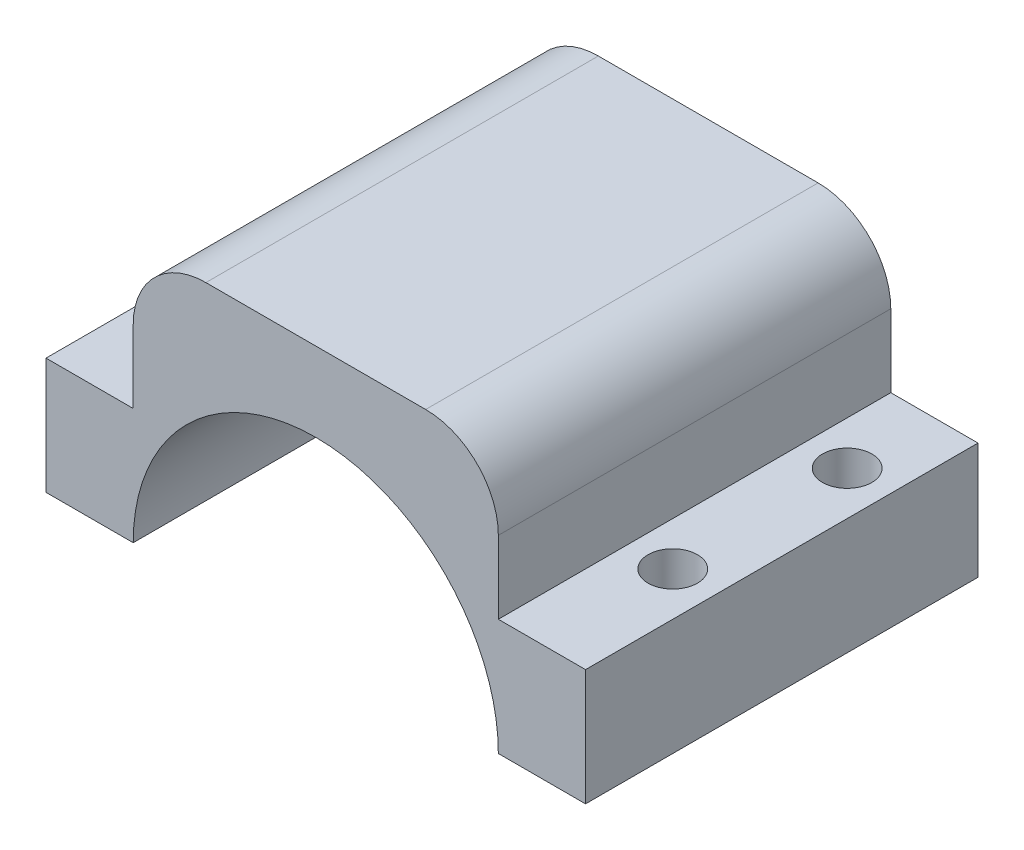
ISO-10303-21;
HEADER;
FILE_DESCRIPTION(('STEP AP214'),'2;1');
FILE_NAME('part.step','',(''),(''),'','','');
FILE_SCHEMA(('AUTOMOTIVE_DESIGN { 1 0 10303 214 1 1 1 1 }'));
ENDSEC;
DATA;
#1=APPLICATION_CONTEXT('core data for automotive mechanical design processes');
#2=APPLICATION_PROTOCOL_DEFINITION('international standard','automotive_design',2000,#1);
#3=PRODUCT_CONTEXT('',#1,'mechanical');
#4=PRODUCT('Part','Part','',(#3));
#5=PRODUCT_RELATED_PRODUCT_CATEGORY('part','',(#4));
#6=PRODUCT_DEFINITION_FORMATION('','',#4);
#7=PRODUCT_DEFINITION_CONTEXT('part definition',#1,'design');
#8=PRODUCT_DEFINITION('design','',#6,#7);
#9=PRODUCT_DEFINITION_SHAPE('','',#8);
#10=(LENGTH_UNIT() NAMED_UNIT(*) SI_UNIT(.MILLI.,.METRE.));
#11=(NAMED_UNIT(*) PLANE_ANGLE_UNIT() SI_UNIT($,.RADIAN.));
#12=(NAMED_UNIT(*) SI_UNIT($,.STERADIAN.) SOLID_ANGLE_UNIT());
#13=UNCERTAINTY_MEASURE_WITH_UNIT(LENGTH_MEASURE(1.E-05),#10,'distance_accuracy_value','');
#14=(GEOMETRIC_REPRESENTATION_CONTEXT(3) GLOBAL_UNCERTAINTY_ASSIGNED_CONTEXT((#13)) GLOBAL_UNIT_ASSIGNED_CONTEXT((#10,
#11,#12)) REPRESENTATION_CONTEXT('',''));
#15=CARTESIAN_POINT('',(0.,0.,0.));
#16=DIRECTION('',(0.,0.,1.));
#17=DIRECTION('',(1.,0.,0.));
#18=AXIS2_PLACEMENT_3D('',#15,#16,#17);
#19=CARTESIAN_POINT('',(0.,0.,27.));
#20=DIRECTION('',(0.,0.,-1.));
#21=DIRECTION('',(-1.,0.,0.));
#22=AXIS2_PLACEMENT_3D('',#19,#20,#21);
#23=CYLINDRICAL_SURFACE('',#22,12.5600623846513);
#24=CARTESIAN_POINT('',(0.,0.,0.));
#25=DIRECTION('',(0.,0.,-1.));
#26=DIRECTION('',(-1.,0.,0.));
#27=AXIS2_PLACEMENT_3D('',#24,#25,#26);
#28=CIRCLE('',#27,12.5600623846513);
#29=CARTESIAN_POINT('',(-12.5600623846513,0.,0.));
#30=VERTEX_POINT('',#29);
#31=CARTESIAN_POINT('',(12.5600623846513,0.,0.));
#32=VERTEX_POINT('',#31);
#33=EDGE_CURVE('E233',#30,#32,#28,.T.);
#34=ORIENTED_EDGE('',*,*,#33,.T.);
#35=DIRECTION('',(0.,0.,-1.));
#36=VECTOR('',#35,1.);
#37=CARTESIAN_POINT('',(12.5600623846513,0.,27.));
#38=LINE('',#37,#36);
#39=CARTESIAN_POINT('',(12.5600623846513,0.,27.));
#40=VERTEX_POINT('',#39);
#41=EDGE_CURVE('E165',#40,#32,#38,.T.);
#42=ORIENTED_EDGE('',*,*,#41,.F.);
#43=CARTESIAN_POINT('',(0.,0.,27.));
#44=DIRECTION('',(0.,0.,-1.));
#45=DIRECTION('',(-1.,0.,0.));
#46=AXIS2_PLACEMENT_3D('',#43,#44,#45);
#47=CIRCLE('',#46,12.5600623846513);
#48=CARTESIAN_POINT('',(-12.5600623846513,0.,27.));
#49=VERTEX_POINT('',#48);
#50=EDGE_CURVE('E150',#49,#40,#47,.T.);
#51=ORIENTED_EDGE('',*,*,#50,.F.);
#52=DIRECTION('',(0.,0.,-1.));
#53=VECTOR('',#52,1.);
#54=CARTESIAN_POINT('',(-12.5600623846513,0.,27.));
#55=LINE('',#54,#53);
#56=EDGE_CURVE('E156',#49,#30,#55,.T.);
#57=ORIENTED_EDGE('',*,*,#56,.T.);
#58=EDGE_LOOP('',(#34,#42,#51,#57));
#59=FACE_BOUND('',#58,.T.);
#60=ADVANCED_FACE('F32',(#59),#23,.F.);
#61=CARTESIAN_POINT('',(12.5600623846513,0.,27.));
#62=DIRECTION('',(0.,1.,0.));
#63=DIRECTION('',(-1.,0.,0.));
#64=AXIS2_PLACEMENT_3D('',#61,#62,#63);
#65=PLANE('',#64);
#66=CARTESIAN_POINT('',(15.5600623846515,0.,18.));
#67=DIRECTION('',(0.,1.,0.));
#68=DIRECTION('',(0.,0.,1.));
#69=AXIS2_PLACEMENT_3D('',#66,#67,#68);
#70=CIRCLE('',#69,1.7);
#71=CARTESIAN_POINT('',(15.5600623846515,0.,19.7));
#72=VERTEX_POINT('',#71);
#73=EDGE_CURVE('E224',#72,#72,#70,.T.);
#74=ORIENTED_EDGE('',*,*,#73,.T.);
#75=EDGE_LOOP('',(#74));
#76=FACE_BOUND('',#75,.T.);
#77=CARTESIAN_POINT('',(15.5600623846513,0.,6.));
#78=DIRECTION('',(0.,1.,0.));
#79=DIRECTION('',(0.,0.,1.));
#80=AXIS2_PLACEMENT_3D('',#77,#78,#79);
#81=CIRCLE('',#80,1.7);
#82=CARTESIAN_POINT('',(15.5600623846513,0.,7.7));
#83=VERTEX_POINT('',#82);
#84=EDGE_CURVE('E230',#83,#83,#81,.T.);
#85=ORIENTED_EDGE('',*,*,#84,.T.);
#86=EDGE_LOOP('',(#85));
#87=FACE_BOUND('',#86,.T.);
#88=DIRECTION('',(1.,0.,0.));
#89=VECTOR('',#88,1.);
#90=CARTESIAN_POINT('',(12.5600623846513,0.,0.));
#91=LINE('',#90,#89);
#92=CARTESIAN_POINT('',(18.5600623846513,0.,0.));
#93=VERTEX_POINT('',#92);
#94=EDGE_CURVE('E246',#32,#93,#91,.T.);
#95=ORIENTED_EDGE('',*,*,#94,.T.);
#96=DIRECTION('',(0.,0.,-1.));
#97=VECTOR('',#96,1.);
#98=CARTESIAN_POINT('',(18.5600623846513,0.,27.));
#99=LINE('',#98,#97);
#100=CARTESIAN_POINT('',(18.5600623846513,0.,27.));
#101=VERTEX_POINT('',#100);
#102=EDGE_CURVE('E162',#101,#93,#99,.T.);
#103=ORIENTED_EDGE('',*,*,#102,.F.);
#104=DIRECTION('',(1.,0.,0.));
#105=VECTOR('',#104,1.);
#106=CARTESIAN_POINT('',(12.5600623846513,0.,27.));
#107=LINE('',#106,#105);
#108=EDGE_CURVE('E236',#40,#101,#107,.T.);
#109=ORIENTED_EDGE('',*,*,#108,.F.);
#110=ORIENTED_EDGE('',*,*,#41,.T.);
#111=EDGE_LOOP('',(#95,#103,#109,#110));
#112=FACE_BOUND('',#111,.T.);
#113=ADVANCED_FACE('F274',(#76,#87,#112),#65,.F.);
#114=CARTESIAN_POINT('',(18.5600623846513,0.,27.));
#115=DIRECTION('',(-1.,0.,0.));
#116=DIRECTION('',(0.,0.,1.));
#117=AXIS2_PLACEMENT_3D('',#114,#115,#116);
#118=PLANE('',#117);
#119=DIRECTION('',(0.,1.,0.));
#120=VECTOR('',#119,1.);
#121=CARTESIAN_POINT('',(18.5600623846513,0.,0.));
#122=LINE('',#121,#120);
#123=CARTESIAN_POINT('',(18.5600623846513,8.,0.));
#124=VERTEX_POINT('',#123);
#125=EDGE_CURVE('E152',#93,#124,#122,.T.);
#126=ORIENTED_EDGE('',*,*,#125,.T.);
#127=DIRECTION('',(0.,0.,-1.));
#128=VECTOR('',#127,1.);
#129=CARTESIAN_POINT('',(18.5600623846513,8.,0.));
#130=LINE('',#129,#128);
#131=CARTESIAN_POINT('',(18.5600623846513,8.,27.));
#132=VERTEX_POINT('',#131);
#133=EDGE_CURVE('E253',#132,#124,#130,.T.);
#134=ORIENTED_EDGE('',*,*,#133,.F.);
#135=DIRECTION('',(0.,1.,0.));
#136=VECTOR('',#135,1.);
#137=CARTESIAN_POINT('',(18.5600623846513,0.,27.));
#138=LINE('',#137,#136);
#139=EDGE_CURVE('E238',#101,#132,#138,.T.);
#140=ORIENTED_EDGE('',*,*,#139,.F.);
#141=ORIENTED_EDGE('',*,*,#102,.T.);
#142=EDGE_LOOP('',(#126,#134,#140,#141));
#143=FACE_BOUND('',#142,.T.);
#144=ADVANCED_FACE('F251',(#143),#118,.F.);
#145=CARTESIAN_POINT('',(-18.5600623846513,18.,27.));
#146=DIRECTION('',(0.,-1.,0.));
#147=DIRECTION('',(0.,0.,-1.));
#148=AXIS2_PLACEMENT_3D('',#145,#146,#147);
#149=PLANE('',#148);
#150=DIRECTION('',(-1.,0.,0.));
#151=VECTOR('',#150,1.);
#152=CARTESIAN_POINT('',(-18.5600623846513,18.,0.));
#153=LINE('',#152,#151);
#154=CARTESIAN_POINT('',(7.56006238465134,18.,0.));
#155=VERTEX_POINT('',#154);
#156=CARTESIAN_POINT('',(-7.56006238465134,18.,0.));
#157=VERTEX_POINT('',#156);
#158=EDGE_CURVE('E148',#155,#157,#153,.T.);
#159=ORIENTED_EDGE('',*,*,#158,.T.);
#160=DIRECTION('',(0.,0.,-1.));
#161=VECTOR('',#160,1.);
#162=CARTESIAN_POINT('',(-7.56006238465135,18.,27.));
#163=LINE('',#162,#161);
#164=CARTESIAN_POINT('',(-7.56006238465135,18.,27.));
#165=VERTEX_POINT('',#164);
#166=EDGE_CURVE('E54',#157,#165,#163,.F.);
#167=ORIENTED_EDGE('',*,*,#166,.T.);
#168=DIRECTION('',(-1.,0.,0.));
#169=VECTOR('',#168,1.);
#170=CARTESIAN_POINT('',(-18.5600623846513,18.,27.));
#171=LINE('',#170,#169);
#172=CARTESIAN_POINT('',(7.56006238465135,18.,27.));
#173=VERTEX_POINT('',#172);
#174=EDGE_CURVE('E194',#173,#165,#171,.T.);
#175=ORIENTED_EDGE('',*,*,#174,.F.);
#176=DIRECTION('',(0.,0.,1.));
#177=VECTOR('',#176,1.);
#178=CARTESIAN_POINT('',(7.56006238465135,18.,27.));
#179=LINE('',#178,#177);
#180=EDGE_CURVE('E185',#173,#155,#179,.F.);
#181=ORIENTED_EDGE('',*,*,#180,.T.);
#182=EDGE_LOOP('',(#159,#167,#175,#181));
#183=FACE_BOUND('',#182,.T.);
#184=ADVANCED_FACE('F203',(#183),#149,.F.);
#185=CARTESIAN_POINT('',(-18.5600623846513,0.,27.));
#186=DIRECTION('',(1.,0.,0.));
#187=DIRECTION('',(0.,0.,-1.));
#188=AXIS2_PLACEMENT_3D('',#185,#186,#187);
#189=PLANE('',#188);
#190=DIRECTION('',(0.,-1.,0.));
#191=VECTOR('',#190,1.);
#192=CARTESIAN_POINT('',(-18.5600623846513,0.,27.));
#193=LINE('',#192,#191);
#194=CARTESIAN_POINT('',(-18.5600623846513,8.,27.));
#195=VERTEX_POINT('',#194);
#196=CARTESIAN_POINT('',(-18.5600623846513,0.,27.));
#197=VERTEX_POINT('',#196);
#198=EDGE_CURVE('E141',#195,#197,#193,.T.);
#199=ORIENTED_EDGE('',*,*,#198,.F.);
#200=DIRECTION('',(0.,0.,1.));
#201=VECTOR('',#200,1.);
#202=CARTESIAN_POINT('',(-18.5600623846513,8.,0.));
#203=LINE('',#202,#201);
#204=CARTESIAN_POINT('',(-18.5600623846513,8.,0.));
#205=VERTEX_POINT('',#204);
#206=EDGE_CURVE('E126',#205,#195,#203,.T.);
#207=ORIENTED_EDGE('',*,*,#206,.F.);
#208=DIRECTION('',(0.,-1.,0.));
#209=VECTOR('',#208,1.);
#210=CARTESIAN_POINT('',(-18.5600623846513,0.,0.));
#211=LINE('',#210,#209);
#212=CARTESIAN_POINT('',(-18.5600623846513,0.,0.));
#213=VERTEX_POINT('',#212);
#214=EDGE_CURVE('E139',#205,#213,#211,.T.);
#215=ORIENTED_EDGE('',*,*,#214,.T.);
#216=DIRECTION('',(0.,0.,-1.));
#217=VECTOR('',#216,1.);
#218=CARTESIAN_POINT('',(-18.5600623846513,0.,27.));
#219=LINE('',#218,#217);
#220=EDGE_CURVE('E159',#197,#213,#219,.T.);
#221=ORIENTED_EDGE('',*,*,#220,.F.);
#222=EDGE_LOOP('',(#199,#207,#215,#221));
#223=FACE_BOUND('',#222,.T.);
#224=ADVANCED_FACE('F137',(#223),#189,.F.);
#225=CARTESIAN_POINT('',(-12.5600623846513,0.,27.));
#226=DIRECTION('',(0.,1.,0.));
#227=DIRECTION('',(-1.,0.,0.));
#228=AXIS2_PLACEMENT_3D('',#225,#226,#227);
#229=PLANE('',#228);
#230=CARTESIAN_POINT('',(-15.5600623846512,0.,18.));
#231=DIRECTION('',(0.,1.,0.));
#232=DIRECTION('',(0.,0.,-1.));
#233=AXIS2_PLACEMENT_3D('',#230,#231,#232);
#234=CIRCLE('',#233,1.7);
#235=CARTESIAN_POINT('',(-15.5600623846512,0.,16.3));
#236=VERTEX_POINT('',#235);
#237=EDGE_CURVE('E221',#236,#236,#234,.T.);
#238=ORIENTED_EDGE('',*,*,#237,.T.);
#239=EDGE_LOOP('',(#238));
#240=FACE_BOUND('',#239,.T.);
#241=CARTESIAN_POINT('',(-15.5600623846513,0.,6.));
#242=DIRECTION('',(0.,1.,0.));
#243=DIRECTION('',(0.,0.,-1.));
#244=AXIS2_PLACEMENT_3D('',#241,#242,#243);
#245=CIRCLE('',#244,1.7);
#246=CARTESIAN_POINT('',(-15.5600623846513,0.,4.3));
#247=VERTEX_POINT('',#246);
#248=EDGE_CURVE('E227',#247,#247,#245,.T.);
#249=ORIENTED_EDGE('',*,*,#248,.T.);
#250=EDGE_LOOP('',(#249));
#251=FACE_BOUND('',#250,.T.);
#252=DIRECTION('',(1.,0.,0.));
#253=VECTOR('',#252,1.);
#254=CARTESIAN_POINT('',(-12.5600623846513,0.,0.));
#255=LINE('',#254,#253);
#256=EDGE_CURVE('E147',#213,#30,#255,.T.);
#257=ORIENTED_EDGE('',*,*,#256,.T.);
#258=ORIENTED_EDGE('',*,*,#56,.F.);
#259=DIRECTION('',(1.,0.,0.));
#260=VECTOR('',#259,1.);
#261=CARTESIAN_POINT('',(-12.5600623846513,0.,27.));
#262=LINE('',#261,#260);
#263=EDGE_CURVE('E160',#197,#49,#262,.T.);
#264=ORIENTED_EDGE('',*,*,#263,.F.);
#265=ORIENTED_EDGE('',*,*,#220,.T.);
#266=EDGE_LOOP('',(#257,#258,#264,#265));
#267=FACE_BOUND('',#266,.T.);
#268=ADVANCED_FACE('F268',(#240,#251,#267),#229,.F.);
#269=CARTESIAN_POINT('',(0.,0.,27.));
#270=DIRECTION('',(0.,0.,-1.));
#271=DIRECTION('',(-1.,0.,0.));
#272=AXIS2_PLACEMENT_3D('',#269,#270,#271);
#273=PLANE('',#272);
#274=ORIENTED_EDGE('',*,*,#174,.T.);
#275=CARTESIAN_POINT('',(-7.56006238465135,13.,27.));
#276=DIRECTION('',(0.,0.,-1.));
#277=DIRECTION('',(-1.,0.,0.));
#278=AXIS2_PLACEMENT_3D('',#275,#276,#277);
#279=CIRCLE('',#278,5.);
#280=CARTESIAN_POINT('',(-12.5600623846513,13.,27.));
#281=VERTEX_POINT('',#280);
#282=EDGE_CURVE('E40',#165,#281,#279,.F.);
#283=ORIENTED_EDGE('',*,*,#282,.T.);
#284=DIRECTION('',(0.,1.,0.));
#285=VECTOR('',#284,1.);
#286=CARTESIAN_POINT('',(-12.5600623846513,8.,27.));
#287=LINE('',#286,#285);
#288=CARTESIAN_POINT('',(-12.5600623846513,8.,27.));
#289=VERTEX_POINT('',#288);
#290=EDGE_CURVE('E193',#289,#281,#287,.T.);
#291=ORIENTED_EDGE('',*,*,#290,.F.);
#292=DIRECTION('',(1.,0.,0.));
#293=VECTOR('',#292,1.);
#294=CARTESIAN_POINT('',(-18.5600623846513,8.,27.));
#295=LINE('',#294,#293);
#296=EDGE_CURVE('E142',#195,#289,#295,.T.);
#297=ORIENTED_EDGE('',*,*,#296,.F.);
#298=ORIENTED_EDGE('',*,*,#198,.T.);
#299=ORIENTED_EDGE('',*,*,#263,.T.);
#300=ORIENTED_EDGE('',*,*,#50,.T.);
#301=ORIENTED_EDGE('',*,*,#108,.T.);
#302=ORIENTED_EDGE('',*,*,#139,.T.);
#303=DIRECTION('',(1.,0.,0.));
#304=VECTOR('',#303,1.);
#305=CARTESIAN_POINT('',(18.5600623846513,8.,27.));
#306=LINE('',#305,#304);
#307=CARTESIAN_POINT('',(12.5600623846513,8.,27.));
#308=VERTEX_POINT('',#307);
#309=EDGE_CURVE('E214',#308,#132,#306,.T.);
#310=ORIENTED_EDGE('',*,*,#309,.F.);
#311=DIRECTION('',(0.,1.,0.));
#312=VECTOR('',#311,1.);
#313=CARTESIAN_POINT('',(12.5600623846513,8.,27.));
#314=LINE('',#313,#312);
#315=CARTESIAN_POINT('',(12.5600623846513,13.,27.));
#316=VERTEX_POINT('',#315);
#317=EDGE_CURVE('E173',#308,#316,#314,.T.);
#318=ORIENTED_EDGE('',*,*,#317,.T.);
#319=CARTESIAN_POINT('',(7.56006238465135,13.,27.));
#320=DIRECTION('',(0.,0.,-1.));
#321=DIRECTION('',(-1.,0.,0.));
#322=AXIS2_PLACEMENT_3D('',#319,#320,#321);
#323=CIRCLE('',#322,5.);
#324=EDGE_CURVE('E47',#316,#173,#323,.F.);
#325=ORIENTED_EDGE('',*,*,#324,.T.);
#326=EDGE_LOOP('',(#274,#283,#291,#297,#298,#299,#300,#301,#302,#310,#318,#325));
#327=FACE_BOUND('',#326,.T.);
#328=ADVANCED_FACE('F192',(#327),#273,.F.);
#329=CARTESIAN_POINT('',(0.,0.,0.));
#330=DIRECTION('',(0.,0.,-1.));
#331=DIRECTION('',(-1.,0.,0.));
#332=AXIS2_PLACEMENT_3D('',#329,#330,#331);
#333=PLANE('',#332);
#334=DIRECTION('',(0.,1.,0.));
#335=VECTOR('',#334,1.);
#336=CARTESIAN_POINT('',(-12.5600623846513,8.,0.));
#337=LINE('',#336,#335);
#338=CARTESIAN_POINT('',(-12.5600623846513,8.,0.));
#339=VERTEX_POINT('',#338);
#340=CARTESIAN_POINT('',(-12.5600623846513,13.,0.));
#341=VERTEX_POINT('',#340);
#342=EDGE_CURVE('E178',#339,#341,#337,.T.);
#343=ORIENTED_EDGE('',*,*,#342,.T.);
#344=CARTESIAN_POINT('',(-7.56006238465134,13.,0.));
#345=DIRECTION('',(0.,0.,-1.));
#346=DIRECTION('',(-1.,0.,0.));
#347=AXIS2_PLACEMENT_3D('',#344,#345,#346);
#348=CIRCLE('',#347,5.);
#349=EDGE_CURVE('E183',#341,#157,#348,.T.);
#350=ORIENTED_EDGE('',*,*,#349,.T.);
#351=ORIENTED_EDGE('',*,*,#158,.F.);
#352=CARTESIAN_POINT('',(7.56006238465134,13.,0.));
#353=DIRECTION('',(0.,0.,-1.));
#354=DIRECTION('',(-1.,0.,0.));
#355=AXIS2_PLACEMENT_3D('',#352,#353,#354);
#356=CIRCLE('',#355,5.);
#357=CARTESIAN_POINT('',(12.5600623846513,13.,0.));
#358=VERTEX_POINT('',#357);
#359=EDGE_CURVE('E181',#155,#358,#356,.T.);
#360=ORIENTED_EDGE('',*,*,#359,.T.);
#361=DIRECTION('',(0.,1.,0.));
#362=VECTOR('',#361,1.);
#363=CARTESIAN_POINT('',(12.5600623846513,8.,0.));
#364=LINE('',#363,#362);
#365=CARTESIAN_POINT('',(12.5600623846513,8.,0.));
#366=VERTEX_POINT('',#365);
#367=EDGE_CURVE('E207',#366,#358,#364,.T.);
#368=ORIENTED_EDGE('',*,*,#367,.F.);
#369=DIRECTION('',(-1.,0.,0.));
#370=VECTOR('',#369,1.);
#371=CARTESIAN_POINT('',(18.5600623846513,8.,0.));
#372=LINE('',#371,#370);
#373=EDGE_CURVE('E255',#124,#366,#372,.T.);
#374=ORIENTED_EDGE('',*,*,#373,.F.);
#375=ORIENTED_EDGE('',*,*,#125,.F.);
#376=ORIENTED_EDGE('',*,*,#94,.F.);
#377=ORIENTED_EDGE('',*,*,#33,.F.);
#378=ORIENTED_EDGE('',*,*,#256,.F.);
#379=ORIENTED_EDGE('',*,*,#214,.F.);
#380=DIRECTION('',(-1.,0.,0.));
#381=VECTOR('',#380,1.);
#382=CARTESIAN_POINT('',(-18.5600623846513,8.,0.));
#383=LINE('',#382,#381);
#384=EDGE_CURVE('E122',#339,#205,#383,.T.);
#385=ORIENTED_EDGE('',*,*,#384,.F.);
#386=EDGE_LOOP('',(#343,#350,#351,#360,#368,#374,#375,#376,#377,#378,#379,#385));
#387=FACE_BOUND('',#386,.T.);
#388=ADVANCED_FACE('F145',(#387),#333,.T.);
#389=CARTESIAN_POINT('',(15.5600623846513,0.,6.));
#390=DIRECTION('',(0.,1.,0.));
#391=DIRECTION('',(0.,0.,1.));
#392=AXIS2_PLACEMENT_3D('',#389,#390,#391);
#393=CYLINDRICAL_SURFACE('',#392,1.7);
#394=CARTESIAN_POINT('',(15.5600623846513,8.,6.));
#395=DIRECTION('',(0.,-1.,0.));
#396=DIRECTION('',(0.,0.,-1.));
#397=AXIS2_PLACEMENT_3D('',#394,#395,#396);
#398=CIRCLE('',#397,1.7);
#399=CARTESIAN_POINT('',(15.5600623846513,8.,4.3));
#400=VERTEX_POINT('',#399);
#401=EDGE_CURVE('E172',#400,#400,#398,.F.);
#402=ORIENTED_EDGE('',*,*,#401,.T.);
#403=EDGE_LOOP('',(#402));
#404=FACE_BOUND('',#403,.T.);
#405=ORIENTED_EDGE('',*,*,#84,.F.);
#406=EDGE_LOOP('',(#405));
#407=FACE_BOUND('',#406,.T.);
#408=ADVANCED_FACE('F315',(#404,#407),#393,.F.);
#409=CARTESIAN_POINT('',(-15.5600623846513,0.,6.));
#410=DIRECTION('',(0.,1.,0.));
#411=DIRECTION('',(0.,0.,1.));
#412=AXIS2_PLACEMENT_3D('',#409,#410,#411);
#413=CYLINDRICAL_SURFACE('',#412,1.7);
#414=CARTESIAN_POINT('',(-15.5600623846513,8.,6.));
#415=DIRECTION('',(0.,-1.,0.));
#416=DIRECTION('',(0.,0.,-1.));
#417=AXIS2_PLACEMENT_3D('',#414,#415,#416);
#418=CIRCLE('',#417,1.7);
#419=CARTESIAN_POINT('',(-15.5600623846513,8.,4.3));
#420=VERTEX_POINT('',#419);
#421=EDGE_CURVE('E177',#420,#420,#418,.F.);
#422=ORIENTED_EDGE('',*,*,#421,.T.);
#423=EDGE_LOOP('',(#422));
#424=FACE_BOUND('',#423,.T.);
#425=ORIENTED_EDGE('',*,*,#248,.F.);
#426=EDGE_LOOP('',(#425));
#427=FACE_BOUND('',#426,.T.);
#428=ADVANCED_FACE('F311',(#424,#427),#413,.F.);
#429=CARTESIAN_POINT('',(15.5600623846515,0.,18.));
#430=DIRECTION('',(0.,1.,0.));
#431=DIRECTION('',(0.,0.,1.));
#432=AXIS2_PLACEMENT_3D('',#429,#430,#431);
#433=CYLINDRICAL_SURFACE('',#432,1.7);
#434=CARTESIAN_POINT('',(15.5600623846515,8.,18.));
#435=DIRECTION('',(0.,-1.,0.));
#436=DIRECTION('',(0.,0.,-1.));
#437=AXIS2_PLACEMENT_3D('',#434,#435,#436);
#438=CIRCLE('',#437,1.7);
#439=CARTESIAN_POINT('',(15.5600623846515,8.,16.3));
#440=VERTEX_POINT('',#439);
#441=EDGE_CURVE('E169',#440,#440,#438,.F.);
#442=ORIENTED_EDGE('',*,*,#441,.T.);
#443=EDGE_LOOP('',(#442));
#444=FACE_BOUND('',#443,.T.);
#445=ORIENTED_EDGE('',*,*,#73,.F.);
#446=EDGE_LOOP('',(#445));
#447=FACE_BOUND('',#446,.T.);
#448=ADVANCED_FACE('F307',(#444,#447),#433,.F.);
#449=CARTESIAN_POINT('',(-15.5600623846512,0.,18.));
#450=DIRECTION('',(0.,1.,0.));
#451=DIRECTION('',(0.,0.,1.));
#452=AXIS2_PLACEMENT_3D('',#449,#450,#451);
#453=CYLINDRICAL_SURFACE('',#452,1.7);
#454=CARTESIAN_POINT('',(-15.5600623846512,8.,18.));
#455=DIRECTION('',(0.,-1.,0.));
#456=DIRECTION('',(0.,0.,-1.));
#457=AXIS2_PLACEMENT_3D('',#454,#455,#456);
#458=CIRCLE('',#457,1.7);
#459=CARTESIAN_POINT('',(-15.5600623846512,8.,16.3));
#460=VERTEX_POINT('',#459);
#461=EDGE_CURVE('E174',#460,#460,#458,.F.);
#462=ORIENTED_EDGE('',*,*,#461,.T.);
#463=EDGE_LOOP('',(#462));
#464=FACE_BOUND('',#463,.T.);
#465=ORIENTED_EDGE('',*,*,#237,.F.);
#466=EDGE_LOOP('',(#465));
#467=FACE_BOUND('',#466,.T.);
#468=ADVANCED_FACE('F301',(#464,#467),#453,.F.);
#469=CARTESIAN_POINT('',(0.,8.,0.));
#470=DIRECTION('',(0.,-1.,0.));
#471=DIRECTION('',(0.,0.,-1.));
#472=AXIS2_PLACEMENT_3D('',#469,#470,#471);
#473=PLANE('',#472);
#474=ORIENTED_EDGE('',*,*,#441,.F.);
#475=EDGE_LOOP('',(#474));
#476=FACE_BOUND('',#475,.T.);
#477=ORIENTED_EDGE('',*,*,#133,.T.);
#478=ORIENTED_EDGE('',*,*,#373,.T.);
#479=DIRECTION('',(0.,0.,1.));
#480=VECTOR('',#479,1.);
#481=CARTESIAN_POINT('',(12.5600623846513,8.,0.));
#482=LINE('',#481,#480);
#483=EDGE_CURVE('E212',#366,#308,#482,.T.);
#484=ORIENTED_EDGE('',*,*,#483,.T.);
#485=ORIENTED_EDGE('',*,*,#309,.T.);
#486=EDGE_LOOP('',(#477,#478,#484,#485));
#487=FACE_BOUND('',#486,.T.);
#488=ORIENTED_EDGE('',*,*,#401,.F.);
#489=EDGE_LOOP('',(#488));
#490=FACE_BOUND('',#489,.T.);
#491=ADVANCED_FACE('F298',(#476,#487,#490),#473,.F.);
#492=CARTESIAN_POINT('',(12.5600623846513,8.,0.));
#493=DIRECTION('',(-1.,0.,0.));
#494=DIRECTION('',(0.,0.,1.));
#495=AXIS2_PLACEMENT_3D('',#492,#493,#494);
#496=PLANE('',#495);
#497=ORIENTED_EDGE('',*,*,#367,.T.);
#498=DIRECTION('',(0.,0.,1.));
#499=VECTOR('',#498,1.);
#500=CARTESIAN_POINT('',(12.5600623846513,13.,0.));
#501=LINE('',#500,#499);
#502=EDGE_CURVE('E11',#358,#316,#501,.T.);
#503=ORIENTED_EDGE('',*,*,#502,.T.);
#504=ORIENTED_EDGE('',*,*,#317,.F.);
#505=ORIENTED_EDGE('',*,*,#483,.F.);
#506=EDGE_LOOP('',(#497,#503,#504,#505));
#507=FACE_BOUND('',#506,.T.);
#508=ADVANCED_FACE('F209',(#507),#496,.F.);
#509=CARTESIAN_POINT('',(0.,8.,0.));
#510=DIRECTION('',(0.,-1.,0.));
#511=DIRECTION('',(0.,0.,-1.));
#512=AXIS2_PLACEMENT_3D('',#509,#510,#511);
#513=PLANE('',#512);
#514=ORIENTED_EDGE('',*,*,#461,.F.);
#515=EDGE_LOOP('',(#514));
#516=FACE_BOUND('',#515,.T.);
#517=ORIENTED_EDGE('',*,*,#384,.T.);
#518=ORIENTED_EDGE('',*,*,#206,.T.);
#519=ORIENTED_EDGE('',*,*,#296,.T.);
#520=DIRECTION('',(0.,0.,-1.));
#521=VECTOR('',#520,1.);
#522=CARTESIAN_POINT('',(-12.5600623846513,8.,0.));
#523=LINE('',#522,#521);
#524=EDGE_CURVE('E129',#289,#339,#523,.T.);
#525=ORIENTED_EDGE('',*,*,#524,.T.);
#526=EDGE_LOOP('',(#517,#518,#519,#525));
#527=FACE_BOUND('',#526,.T.);
#528=ORIENTED_EDGE('',*,*,#421,.F.);
#529=EDGE_LOOP('',(#528));
#530=FACE_BOUND('',#529,.T.);
#531=ADVANCED_FACE('F124',(#516,#527,#530),#513,.F.);
#532=CARTESIAN_POINT('',(-12.5600623846513,8.,0.));
#533=DIRECTION('',(1.,0.,0.));
#534=DIRECTION('',(0.,0.,-1.));
#535=AXIS2_PLACEMENT_3D('',#532,#533,#534);
#536=PLANE('',#535);
#537=ORIENTED_EDGE('',*,*,#290,.T.);
#538=DIRECTION('',(0.,0.,-1.));
#539=VECTOR('',#538,1.);
#540=CARTESIAN_POINT('',(-12.5600623846513,13.,0.));
#541=LINE('',#540,#539);
#542=EDGE_CURVE('E168',#281,#341,#541,.T.);
#543=ORIENTED_EDGE('',*,*,#542,.T.);
#544=ORIENTED_EDGE('',*,*,#342,.F.);
#545=ORIENTED_EDGE('',*,*,#524,.F.);
#546=EDGE_LOOP('',(#537,#543,#544,#545));
#547=FACE_BOUND('',#546,.T.);
#548=ADVANCED_FACE('F198',(#547),#536,.F.);
#549=CARTESIAN_POINT('',(-7.56006238465134,13.,0.));
#550=DIRECTION('',(0.,0.,-1.));
#551=DIRECTION('',(-1.,0.,0.));
#552=AXIS2_PLACEMENT_3D('',#549,#550,#551);
#553=CYLINDRICAL_SURFACE('',#552,5.);
#554=ORIENTED_EDGE('',*,*,#282,.F.);
#555=ORIENTED_EDGE('',*,*,#166,.F.);
#556=ORIENTED_EDGE('',*,*,#349,.F.);
#557=ORIENTED_EDGE('',*,*,#542,.F.);
#558=EDGE_LOOP('',(#554,#555,#556,#557));
#559=FACE_BOUND('',#558,.T.);
#560=ADVANCED_FACE('F200',(#559),#553,.T.);
#561=CARTESIAN_POINT('',(7.56006238465134,13.,0.));
#562=DIRECTION('',(0.,0.,1.));
#563=DIRECTION('',(1.,0.,0.));
#564=AXIS2_PLACEMENT_3D('',#561,#562,#563);
#565=CYLINDRICAL_SURFACE('',#564,5.);
#566=ORIENTED_EDGE('',*,*,#359,.F.);
#567=ORIENTED_EDGE('',*,*,#180,.F.);
#568=ORIENTED_EDGE('',*,*,#324,.F.);
#569=ORIENTED_EDGE('',*,*,#502,.F.);
#570=EDGE_LOOP('',(#566,#567,#568,#569));
#571=FACE_BOUND('',#570,.T.);
#572=ADVANCED_FACE('F34',(#571),#565,.T.);
#573=CLOSED_SHELL('',(#60,#113,#144,#184,#224,#268,#328,#388,#408,#428,#448,#468,#491,#508,#531,
#548,#560,#572));
#574=MANIFOLD_SOLID_BREP('B2',#573);
#575=ADVANCED_BREP_SHAPE_REPRESENTATION('',(#18,#574),#14);
#576=SHAPE_DEFINITION_REPRESENTATION(#9,#575);
ENDSEC;
END-ISO-10303-21;
